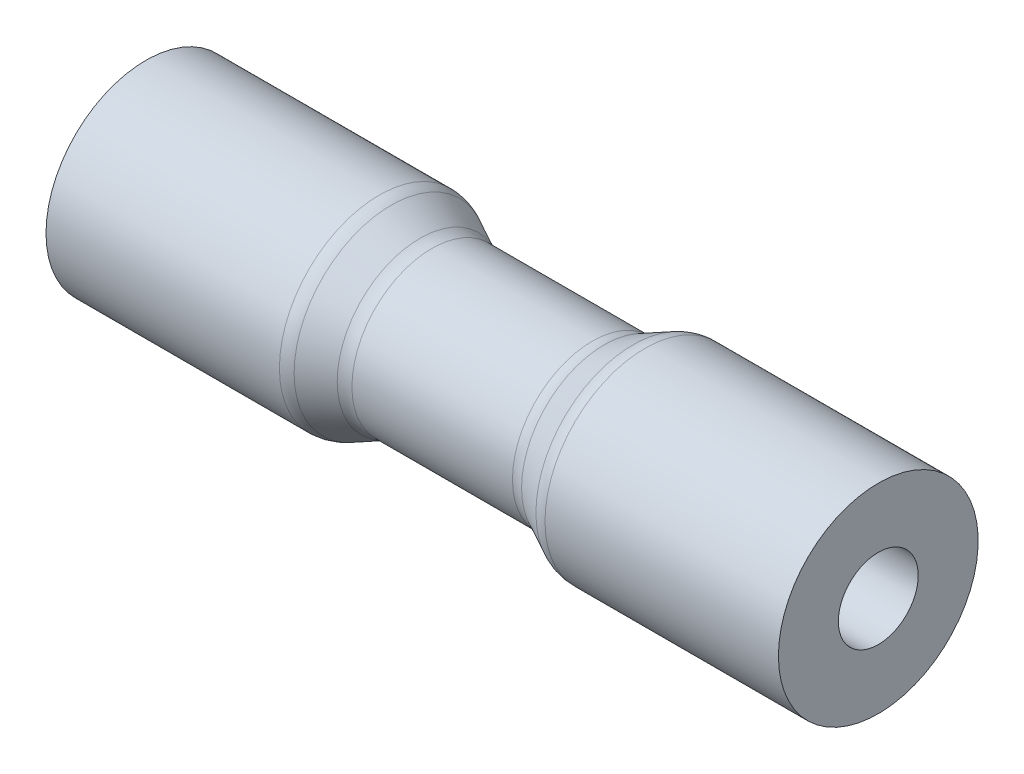
ISO-10303-21;
HEADER;
FILE_DESCRIPTION(('STEP AP214'),'2;1');
FILE_NAME('part.step','',(''),(''),'','','');
FILE_SCHEMA(('AUTOMOTIVE_DESIGN { 1 0 10303 214 1 1 1 1 }'));
ENDSEC;
DATA;
#1=APPLICATION_CONTEXT('core data for automotive mechanical design processes');
#2=APPLICATION_PROTOCOL_DEFINITION('international standard','automotive_design',2000,#1);
#3=PRODUCT_CONTEXT('',#1,'mechanical');
#4=PRODUCT('Part','Part','',(#3));
#5=PRODUCT_RELATED_PRODUCT_CATEGORY('part','',(#4));
#6=PRODUCT_DEFINITION_FORMATION('','',#4);
#7=PRODUCT_DEFINITION_CONTEXT('part definition',#1,'design');
#8=PRODUCT_DEFINITION('design','',#6,#7);
#9=PRODUCT_DEFINITION_SHAPE('','',#8);
#10=(LENGTH_UNIT() NAMED_UNIT(*) SI_UNIT(.MILLI.,.METRE.));
#11=(NAMED_UNIT(*) PLANE_ANGLE_UNIT() SI_UNIT($,.RADIAN.));
#12=(NAMED_UNIT(*) SI_UNIT($,.STERADIAN.) SOLID_ANGLE_UNIT());
#13=UNCERTAINTY_MEASURE_WITH_UNIT(LENGTH_MEASURE(1.E-05),#10,'distance_accuracy_value','');
#14=(GEOMETRIC_REPRESENTATION_CONTEXT(3) GLOBAL_UNCERTAINTY_ASSIGNED_CONTEXT((#13)) GLOBAL_UNIT_ASSIGNED_CONTEXT((#10,
#11,#12)) REPRESENTATION_CONTEXT('',''));
#15=CARTESIAN_POINT('',(0.,0.,0.));
#16=DIRECTION('',(0.,0.,1.));
#17=DIRECTION('',(1.,0.,0.));
#18=AXIS2_PLACEMENT_3D('',#15,#16,#17);
#19=CARTESIAN_POINT('',(9.97213595499958,0.,0.));
#20=DIRECTION('',(-1.,0.,0.));
#21=DIRECTION('',(0.,0.,1.));
#22=AXIS2_PLACEMENT_3D('',#19,#20,#21);
#23=TOROIDAL_SURFACE('',#22,5.5,2.);
#24=CARTESIAN_POINT('',(9.07770876399966,0.,0.));
#25=DIRECTION('',(-1.,0.,0.));
#26=DIRECTION('',(0.,0.,1.));
#27=AXIS2_PLACEMENT_3D('',#24,#25,#26);
#28=CIRCLE('',#27,7.28885438199983);
#29=CARTESIAN_POINT('',(9.07770876399966,0.,7.28885438199983));
#30=VERTEX_POINT('',#29);
#31=EDGE_CURVE('E10',#30,#30,#28,.T.);
#32=ORIENTED_EDGE('',*,*,#31,.F.);
#33=EDGE_LOOP('',(#32));
#34=FACE_BOUND('',#33,.T.);
#35=CARTESIAN_POINT('',(9.97213595499959,0.,0.));
#36=DIRECTION('',(-1.,0.,0.));
#37=DIRECTION('',(0.,0.,1.));
#38=AXIS2_PLACEMENT_3D('',#35,#36,#37);
#39=CIRCLE('',#38,7.5);
#40=CARTESIAN_POINT('',(9.97213595499959,0.,7.5));
#41=VERTEX_POINT('',#40);
#42=EDGE_CURVE('E102',#41,#41,#39,.T.);
#43=ORIENTED_EDGE('',*,*,#42,.T.);
#44=EDGE_LOOP('',(#43));
#45=FACE_BOUND('',#44,.T.);
#46=ADVANCED_FACE('F43',(#34,#45),#23,.T.);
#47=CARTESIAN_POINT('',(9.07770876399966,0.,0.));
#48=DIRECTION('',(1.,0.,0.));
#49=DIRECTION('',(0.,0.,-1.));
#50=AXIS2_PLACEMENT_3D('',#47,#48,#49);
#51=CONICAL_SURFACE('',#50,7.28885438199983,0.463647609000806);
#52=CARTESIAN_POINT('',(6.92229123600035,0.,0.));
#53=DIRECTION('',(-1.,0.,0.));
#54=DIRECTION('',(0.,0.,1.));
#55=AXIS2_PLACEMENT_3D('',#52,#53,#54);
#56=CIRCLE('',#55,6.21114561800017);
#57=CARTESIAN_POINT('',(6.92229123600035,0.,6.21114561800017));
#58=VERTEX_POINT('',#57);
#59=EDGE_CURVE('E50',#58,#58,#56,.T.);
#60=ORIENTED_EDGE('',*,*,#59,.F.);
#61=EDGE_LOOP('',(#60));
#62=FACE_BOUND('',#61,.T.);
#63=ORIENTED_EDGE('',*,*,#31,.T.);
#64=EDGE_LOOP('',(#63));
#65=FACE_BOUND('',#64,.T.);
#66=ADVANCED_FACE('F137',(#62,#65),#51,.T.);
#67=CARTESIAN_POINT('',(6.02786404500042,0.,0.));
#68=DIRECTION('',(-1.,0.,0.));
#69=DIRECTION('',(0.,0.,1.));
#70=AXIS2_PLACEMENT_3D('',#67,#68,#69);
#71=TOROIDAL_SURFACE('',#70,8.,2.);
#72=CARTESIAN_POINT('',(6.02786404500041,0.,0.));
#73=DIRECTION('',(-1.,0.,0.));
#74=DIRECTION('',(0.,0.,1.));
#75=AXIS2_PLACEMENT_3D('',#72,#73,#74);
#76=CIRCLE('',#75,6.);
#77=CARTESIAN_POINT('',(6.02786404500041,0.,6.));
#78=VERTEX_POINT('',#77);
#79=EDGE_CURVE('E55',#78,#78,#76,.T.);
#80=ORIENTED_EDGE('',*,*,#79,.F.);
#81=EDGE_LOOP('',(#80));
#82=FACE_BOUND('',#81,.T.);
#83=ORIENTED_EDGE('',*,*,#59,.T.);
#84=EDGE_LOOP('',(#83));
#85=FACE_BOUND('',#84,.T.);
#86=ADVANCED_FACE('F142',(#82,#85),#71,.F.);
#87=CARTESIAN_POINT('',(-44.0873068467502,0.,0.));
#88=DIRECTION('',(-1.,0.,0.));
#89=DIRECTION('',(0.,0.,1.));
#90=AXIS2_PLACEMENT_3D('',#87,#88,#89);
#91=CYLINDRICAL_SURFACE('',#90,6.);
#92=CARTESIAN_POINT('',(-6.02786404500041,0.,0.));
#93=DIRECTION('',(-1.,0.,0.));
#94=DIRECTION('',(0.,0.,1.));
#95=AXIS2_PLACEMENT_3D('',#92,#93,#94);
#96=CIRCLE('',#95,6.);
#97=CARTESIAN_POINT('',(-6.02786404500041,0.,6.));
#98=VERTEX_POINT('',#97);
#99=EDGE_CURVE('E60',#98,#98,#96,.T.);
#100=ORIENTED_EDGE('',*,*,#99,.F.);
#101=EDGE_LOOP('',(#100));
#102=FACE_BOUND('',#101,.T.);
#103=ORIENTED_EDGE('',*,*,#79,.T.);
#104=EDGE_LOOP('',(#103));
#105=FACE_BOUND('',#104,.T.);
#106=ADVANCED_FACE('F147',(#102,#105),#91,.T.);
#107=CARTESIAN_POINT('',(-6.02786404500042,0.,0.));
#108=DIRECTION('',(-1.,0.,0.));
#109=DIRECTION('',(0.,0.,1.));
#110=AXIS2_PLACEMENT_3D('',#107,#108,#109);
#111=TOROIDAL_SURFACE('',#110,8.,2.);
#112=CARTESIAN_POINT('',(-6.92229123600034,0.,0.));
#113=DIRECTION('',(-1.,0.,0.));
#114=DIRECTION('',(0.,0.,1.));
#115=AXIS2_PLACEMENT_3D('',#112,#113,#114);
#116=CIRCLE('',#115,6.21114561800017);
#117=CARTESIAN_POINT('',(-6.92229123600034,0.,6.21114561800017));
#118=VERTEX_POINT('',#117);
#119=EDGE_CURVE('E66',#118,#118,#116,.T.);
#120=ORIENTED_EDGE('',*,*,#119,.F.);
#121=EDGE_LOOP('',(#120));
#122=FACE_BOUND('',#121,.T.);
#123=ORIENTED_EDGE('',*,*,#99,.T.);
#124=EDGE_LOOP('',(#123));
#125=FACE_BOUND('',#124,.T.);
#126=ADVANCED_FACE('F153',(#122,#125),#111,.F.);
#127=CARTESIAN_POINT('',(-6.92229123600034,0.,0.));
#128=DIRECTION('',(-1.,0.,0.));
#129=DIRECTION('',(0.,0.,1.));
#130=AXIS2_PLACEMENT_3D('',#127,#128,#129);
#131=CONICAL_SURFACE('',#130,6.21114561800017,0.463647609000805);
#132=CARTESIAN_POINT('',(-9.07770876399966,0.,0.));
#133=DIRECTION('',(-1.,0.,0.));
#134=DIRECTION('',(0.,0.,1.));
#135=AXIS2_PLACEMENT_3D('',#132,#133,#134);
#136=CIRCLE('',#135,7.28885438199983);
#137=CARTESIAN_POINT('',(-9.07770876399966,0.,7.28885438199983));
#138=VERTEX_POINT('',#137);
#139=EDGE_CURVE('E70',#138,#138,#136,.T.);
#140=ORIENTED_EDGE('',*,*,#139,.F.);
#141=EDGE_LOOP('',(#140));
#142=FACE_BOUND('',#141,.T.);
#143=ORIENTED_EDGE('',*,*,#119,.T.);
#144=EDGE_LOOP('',(#143));
#145=FACE_BOUND('',#144,.T.);
#146=ADVANCED_FACE('F157',(#142,#145),#131,.T.);
#147=CARTESIAN_POINT('',(-9.97213595499958,0.,0.));
#148=DIRECTION('',(-1.,0.,0.));
#149=DIRECTION('',(0.,0.,1.));
#150=AXIS2_PLACEMENT_3D('',#147,#148,#149);
#151=TOROIDAL_SURFACE('',#150,5.5,2.);
#152=CARTESIAN_POINT('',(-9.97213595499959,0.,0.));
#153=DIRECTION('',(-1.,0.,0.));
#154=DIRECTION('',(0.,0.,1.));
#155=AXIS2_PLACEMENT_3D('',#152,#153,#154);
#156=CIRCLE('',#155,7.5);
#157=CARTESIAN_POINT('',(-9.97213595499959,0.,7.5));
#158=VERTEX_POINT('',#157);
#159=EDGE_CURVE('E74',#158,#158,#156,.T.);
#160=ORIENTED_EDGE('',*,*,#159,.F.);
#161=EDGE_LOOP('',(#160));
#162=FACE_BOUND('',#161,.T.);
#163=ORIENTED_EDGE('',*,*,#139,.T.);
#164=EDGE_LOOP('',(#163));
#165=FACE_BOUND('',#164,.T.);
#166=ADVANCED_FACE('F161',(#162,#165),#151,.T.);
#167=CARTESIAN_POINT('',(-44.0873068467502,0.,0.));
#168=DIRECTION('',(-1.,0.,0.));
#169=DIRECTION('',(0.,0.,1.));
#170=AXIS2_PLACEMENT_3D('',#167,#168,#169);
#171=CYLINDRICAL_SURFACE('',#170,7.49999999999999);
#172=CARTESIAN_POINT('',(-27.5,0.,0.));
#173=DIRECTION('',(-1.,0.,0.));
#174=DIRECTION('',(0.,0.,1.));
#175=AXIS2_PLACEMENT_3D('',#172,#173,#174);
#176=CIRCLE('',#175,7.49999999999999);
#177=CARTESIAN_POINT('',(-27.5,0.,7.49999999999999));
#178=VERTEX_POINT('',#177);
#179=EDGE_CURVE('E78',#178,#178,#176,.T.);
#180=ORIENTED_EDGE('',*,*,#179,.F.);
#181=EDGE_LOOP('',(#180));
#182=FACE_BOUND('',#181,.T.);
#183=ORIENTED_EDGE('',*,*,#159,.T.);
#184=EDGE_LOOP('',(#183));
#185=FACE_BOUND('',#184,.T.);
#186=ADVANCED_FACE('F165',(#182,#185),#171,.T.);
#187=CARTESIAN_POINT('',(-27.5,7.49999999999999,0.));
#188=DIRECTION('',(1.,0.,0.));
#189=DIRECTION('',(0.,0.,-1.));
#190=AXIS2_PLACEMENT_3D('',#187,#188,#189);
#191=PLANE('',#190);
#192=CARTESIAN_POINT('',(-27.5,0.,0.));
#193=DIRECTION('',(-1.,0.,0.));
#194=DIRECTION('',(0.,0.,1.));
#195=AXIS2_PLACEMENT_3D('',#192,#193,#194);
#196=CIRCLE('',#195,3.);
#197=CARTESIAN_POINT('',(-27.5,0.,3.));
#198=VERTEX_POINT('',#197);
#199=EDGE_CURVE('E82',#198,#198,#196,.T.);
#200=ORIENTED_EDGE('',*,*,#199,.F.);
#201=EDGE_LOOP('',(#200));
#202=FACE_BOUND('',#201,.T.);
#203=ORIENTED_EDGE('',*,*,#179,.T.);
#204=EDGE_LOOP('',(#203));
#205=FACE_BOUND('',#204,.T.);
#206=ADVANCED_FACE('F169',(#202,#205),#191,.F.);
#207=CARTESIAN_POINT('',(-44.0873068467502,0.,0.));
#208=DIRECTION('',(-1.,0.,0.));
#209=DIRECTION('',(0.,0.,1.));
#210=AXIS2_PLACEMENT_3D('',#207,#208,#209);
#211=CYLINDRICAL_SURFACE('',#210,3.);
#212=CARTESIAN_POINT('',(-14.5,0.,0.));
#213=DIRECTION('',(-1.,0.,0.));
#214=DIRECTION('',(0.,0.,1.));
#215=AXIS2_PLACEMENT_3D('',#212,#213,#214);
#216=CIRCLE('',#215,3.);
#217=CARTESIAN_POINT('',(-14.5,0.,3.));
#218=VERTEX_POINT('',#217);
#219=EDGE_CURVE('E86',#218,#218,#216,.T.);
#220=ORIENTED_EDGE('',*,*,#219,.F.);
#221=EDGE_LOOP('',(#220));
#222=FACE_BOUND('',#221,.T.);
#223=ORIENTED_EDGE('',*,*,#199,.T.);
#224=EDGE_LOOP('',(#223));
#225=FACE_BOUND('',#224,.T.);
#226=ADVANCED_FACE('F133',(#222,#225),#211,.F.);
#227=CARTESIAN_POINT('',(-14.5,0.,0.));
#228=DIRECTION('',(1.,0.,0.));
#229=DIRECTION('',(0.,0.,-1.));
#230=AXIS2_PLACEMENT_3D('',#227,#228,#229);
#231=PLANE('',#230);
#232=ORIENTED_EDGE('',*,*,#219,.T.);
#233=EDGE_LOOP('',(#232));
#234=FACE_BOUND('',#233,.T.);
#235=ADVANCED_FACE('F128',(#234),#231,.F.);
#236=CARTESIAN_POINT('',(14.5,0.,0.));
#237=DIRECTION('',(-1.,0.,0.));
#238=DIRECTION('',(0.,0.,1.));
#239=AXIS2_PLACEMENT_3D('',#236,#237,#238);
#240=PLANE('',#239);
#241=CARTESIAN_POINT('',(14.5,0.,0.));
#242=DIRECTION('',(-1.,0.,0.));
#243=DIRECTION('',(0.,0.,1.));
#244=AXIS2_PLACEMENT_3D('',#241,#242,#243);
#245=CIRCLE('',#244,3.);
#246=CARTESIAN_POINT('',(14.5,0.,3.));
#247=VERTEX_POINT('',#246);
#248=EDGE_CURVE('E90',#247,#247,#245,.T.);
#249=ORIENTED_EDGE('',*,*,#248,.F.);
#250=EDGE_LOOP('',(#249));
#251=FACE_BOUND('',#250,.T.);
#252=ADVANCED_FACE('F123',(#251),#240,.F.);
#253=CARTESIAN_POINT('',(-44.0873068467502,0.,0.));
#254=DIRECTION('',(-1.,0.,0.));
#255=DIRECTION('',(0.,0.,1.));
#256=AXIS2_PLACEMENT_3D('',#253,#254,#255);
#257=CYLINDRICAL_SURFACE('',#256,3.);
#258=CARTESIAN_POINT('',(27.5,0.,0.));
#259=DIRECTION('',(-1.,0.,0.));
#260=DIRECTION('',(0.,0.,1.));
#261=AXIS2_PLACEMENT_3D('',#258,#259,#260);
#262=CIRCLE('',#261,3.);
#263=CARTESIAN_POINT('',(27.5,0.,3.));
#264=VERTEX_POINT('',#263);
#265=EDGE_CURVE('E94',#264,#264,#262,.T.);
#266=ORIENTED_EDGE('',*,*,#265,.F.);
#267=EDGE_LOOP('',(#266));
#268=FACE_BOUND('',#267,.T.);
#269=ORIENTED_EDGE('',*,*,#248,.T.);
#270=EDGE_LOOP('',(#269));
#271=FACE_BOUND('',#270,.T.);
#272=ADVANCED_FACE('F117',(#268,#271),#257,.F.);
#273=CARTESIAN_POINT('',(27.5,3.,0.));
#274=DIRECTION('',(-1.,0.,0.));
#275=DIRECTION('',(0.,0.,1.));
#276=AXIS2_PLACEMENT_3D('',#273,#274,#275);
#277=PLANE('',#276);
#278=CARTESIAN_POINT('',(27.5,0.,0.));
#279=DIRECTION('',(-1.,0.,0.));
#280=DIRECTION('',(0.,0.,1.));
#281=AXIS2_PLACEMENT_3D('',#278,#279,#280);
#282=CIRCLE('',#281,7.5);
#283=CARTESIAN_POINT('',(27.5,0.,7.5));
#284=VERTEX_POINT('',#283);
#285=EDGE_CURVE('E98',#284,#284,#282,.T.);
#286=ORIENTED_EDGE('',*,*,#285,.F.);
#287=EDGE_LOOP('',(#286));
#288=FACE_BOUND('',#287,.T.);
#289=ORIENTED_EDGE('',*,*,#265,.T.);
#290=EDGE_LOOP('',(#289));
#291=FACE_BOUND('',#290,.T.);
#292=ADVANCED_FACE('F111',(#288,#291),#277,.F.);
#293=CARTESIAN_POINT('',(-44.0873068467502,0.,0.));
#294=DIRECTION('',(-1.,0.,0.));
#295=DIRECTION('',(0.,0.,1.));
#296=AXIS2_PLACEMENT_3D('',#293,#294,#295);
#297=CYLINDRICAL_SURFACE('',#296,7.5);
#298=ORIENTED_EDGE('',*,*,#42,.F.);
#299=EDGE_LOOP('',(#298));
#300=FACE_BOUND('',#299,.T.);
#301=ORIENTED_EDGE('',*,*,#285,.T.);
#302=EDGE_LOOP('',(#301));
#303=FACE_BOUND('',#302,.T.);
#304=ADVANCED_FACE('F108',(#300,#303),#297,.T.);
#305=CLOSED_SHELL('',(#46,#66,#86,#106,#126,#146,#166,#186,#206,#226,#235,#252,#272,#292,#304));
#306=MANIFOLD_SOLID_BREP('B2',#305);
#307=ADVANCED_BREP_SHAPE_REPRESENTATION('',(#18,#306),#14);
#308=SHAPE_DEFINITION_REPRESENTATION(#9,#307);
ENDSEC;
END-ISO-10303-21;
